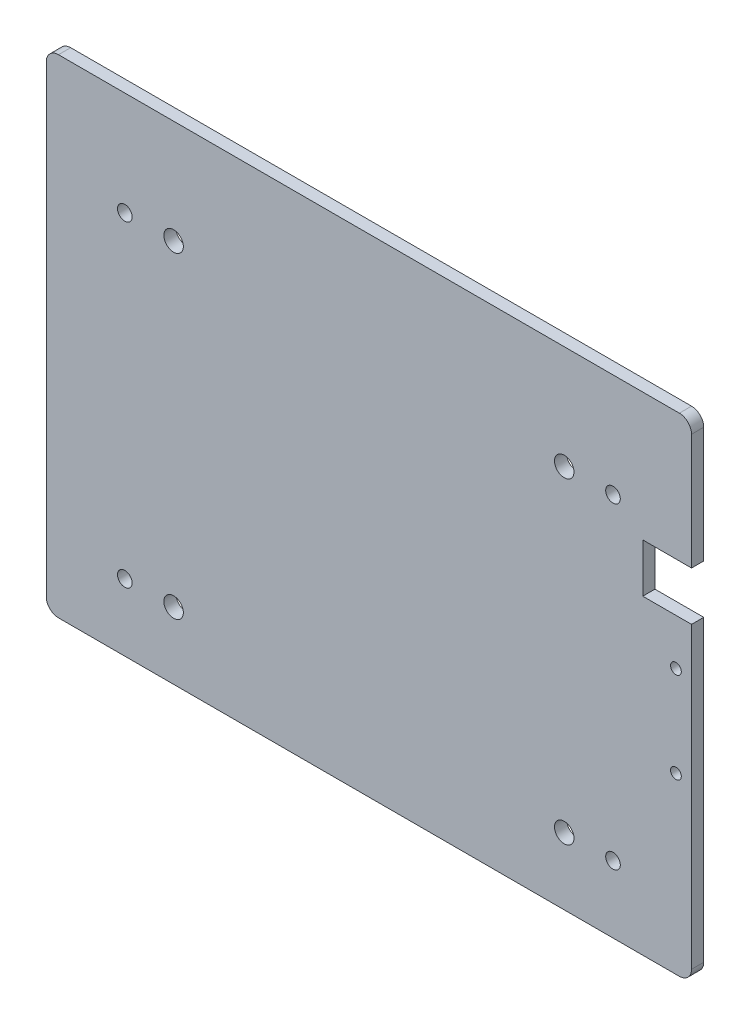
ISO-10303-21;
HEADER;
FILE_DESCRIPTION(('STEP AP214'),'2;1');
FILE_NAME('part.step','',(''),(''),'','','');
FILE_SCHEMA(('AUTOMOTIVE_DESIGN { 1 0 10303 214 1 1 1 1 }'));
ENDSEC;
DATA;
#1=APPLICATION_CONTEXT('core data for automotive mechanical design processes');
#2=APPLICATION_PROTOCOL_DEFINITION('international standard','automotive_design',2000,#1);
#3=PRODUCT_CONTEXT('',#1,'mechanical');
#4=PRODUCT('Part','Part','',(#3));
#5=PRODUCT_RELATED_PRODUCT_CATEGORY('part','',(#4));
#6=PRODUCT_DEFINITION_FORMATION('','',#4);
#7=PRODUCT_DEFINITION_CONTEXT('part definition',#1,'design');
#8=PRODUCT_DEFINITION('design','',#6,#7);
#9=PRODUCT_DEFINITION_SHAPE('','',#8);
#10=(LENGTH_UNIT() NAMED_UNIT(*) SI_UNIT(.MILLI.,.METRE.));
#11=(NAMED_UNIT(*) PLANE_ANGLE_UNIT() SI_UNIT($,.RADIAN.));
#12=(NAMED_UNIT(*) SI_UNIT($,.STERADIAN.) SOLID_ANGLE_UNIT());
#13=UNCERTAINTY_MEASURE_WITH_UNIT(LENGTH_MEASURE(1.E-05),#10,'distance_accuracy_value','');
#14=(GEOMETRIC_REPRESENTATION_CONTEXT(3) GLOBAL_UNCERTAINTY_ASSIGNED_CONTEXT((#13)) GLOBAL_UNIT_ASSIGNED_CONTEXT((#10,
#11,#12)) REPRESENTATION_CONTEXT('',''));
#15=CARTESIAN_POINT('',(0.,0.,0.));
#16=DIRECTION('',(0.,0.,1.));
#17=DIRECTION('',(1.,0.,0.));
#18=AXIS2_PLACEMENT_3D('',#15,#16,#17);
#19=CARTESIAN_POINT('',(-15.2,-30.,5.));
#20=DIRECTION('',(1.,0.,0.));
#21=DIRECTION('',(0.,1.,0.));
#22=AXIS2_PLACEMENT_3D('',#19,#20,#21);
#23=PLANE('',#22);
#24=DIRECTION('',(0.,0.,1.));
#25=VECTOR('',#24,1.);
#26=CARTESIAN_POINT('',(-15.2,-102.5,0.));
#27=LINE('',#26,#25);
#28=CARTESIAN_POINT('',(-15.2,-102.5,0.));
#29=VERTEX_POINT('',#28);
#30=CARTESIAN_POINT('',(-15.2,-102.5,5.));
#31=VERTEX_POINT('',#30);
#32=EDGE_CURVE('E155',#29,#31,#27,.T.);
#33=ORIENTED_EDGE('',*,*,#32,.T.);
#34=DIRECTION('',(0.,-1.,0.));
#35=VECTOR('',#34,1.);
#36=CARTESIAN_POINT('',(-15.2,-30.,5.));
#37=LINE('',#36,#35);
#38=CARTESIAN_POINT('',(-15.2,-225.,5.));
#39=VERTEX_POINT('',#38);
#40=EDGE_CURVE('E57',#31,#39,#37,.T.);
#41=ORIENTED_EDGE('',*,*,#40,.T.);
#42=DIRECTION('',(0.,0.,-1.));
#43=VECTOR('',#42,1.);
#44=CARTESIAN_POINT('',(-15.2,-225.,5.));
#45=LINE('',#44,#43);
#46=CARTESIAN_POINT('',(-15.2,-225.,0.));
#47=VERTEX_POINT('',#46);
#48=EDGE_CURVE('E268',#39,#47,#45,.T.);
#49=ORIENTED_EDGE('',*,*,#48,.T.);
#50=DIRECTION('',(0.,-1.,0.));
#51=VECTOR('',#50,1.);
#52=CARTESIAN_POINT('',(-15.2,-30.,0.));
#53=LINE('',#52,#51);
#54=EDGE_CURVE('E239',#29,#47,#53,.T.);
#55=ORIENTED_EDGE('',*,*,#54,.F.);
#56=EDGE_LOOP('',(#33,#41,#49,#55));
#57=FACE_BOUND('',#56,.T.);
#58=ADVANCED_FACE('F34',(#57),#23,.T.);
#59=CARTESIAN_POINT('',(0.,0.,0.));
#60=DIRECTION('',(0.,0.,-1.));
#61=DIRECTION('',(-1.,0.,0.));
#62=AXIS2_PLACEMENT_3D('',#59,#60,#61);
#63=PLANE('',#62);
#64=DIRECTION('',(1.,0.,0.));
#65=VECTOR('',#64,1.);
#66=CARTESIAN_POINT('',(-15.2,-102.5,0.));
#67=LINE('',#66,#65);
#68=CARTESIAN_POINT('',(-35.2,-102.5,0.));
#69=VERTEX_POINT('',#68);
#70=EDGE_CURVE('E140',#69,#29,#67,.T.);
#71=ORIENTED_EDGE('',*,*,#70,.T.);
#72=ORIENTED_EDGE('',*,*,#54,.T.);
#73=CARTESIAN_POINT('',(-20.2,-225.,0.));
#74=DIRECTION('',(0.,0.,-1.));
#75=DIRECTION('',(-1.,0.,0.));
#76=AXIS2_PLACEMENT_3D('',#73,#74,#75);
#77=CIRCLE('',#76,5.);
#78=CARTESIAN_POINT('',(-20.2,-230.,0.));
#79=VERTEX_POINT('',#78);
#80=EDGE_CURVE('E247',#47,#79,#77,.T.);
#81=ORIENTED_EDGE('',*,*,#80,.T.);
#82=DIRECTION('',(-1.,0.,0.));
#83=VECTOR('',#82,1.);
#84=CARTESIAN_POINT('',(-15.2,-230.,0.));
#85=LINE('',#84,#83);
#86=CARTESIAN_POINT('',(-274.8,-230.,0.));
#87=VERTEX_POINT('',#86);
#88=EDGE_CURVE('E224',#79,#87,#85,.T.);
#89=ORIENTED_EDGE('',*,*,#88,.T.);
#90=CARTESIAN_POINT('',(-274.8,-225.,0.));
#91=DIRECTION('',(0.,0.,-1.));
#92=DIRECTION('',(-1.,0.,0.));
#93=AXIS2_PLACEMENT_3D('',#90,#91,#92);
#94=CIRCLE('',#93,5.);
#95=CARTESIAN_POINT('',(-279.8,-225.,0.));
#96=VERTEX_POINT('',#95);
#97=EDGE_CURVE('E249',#87,#96,#94,.T.);
#98=ORIENTED_EDGE('',*,*,#97,.T.);
#99=DIRECTION('',(0.,1.,0.));
#100=VECTOR('',#99,1.);
#101=CARTESIAN_POINT('',(-279.8,-30.,0.));
#102=LINE('',#101,#100);
#103=CARTESIAN_POINT('',(-279.8,-35.,0.));
#104=VERTEX_POINT('',#103);
#105=EDGE_CURVE('E217',#96,#104,#102,.T.);
#106=ORIENTED_EDGE('',*,*,#105,.T.);
#107=CARTESIAN_POINT('',(-274.8,-35.,0.));
#108=DIRECTION('',(0.,0.,-1.));
#109=DIRECTION('',(-1.,0.,0.));
#110=AXIS2_PLACEMENT_3D('',#107,#108,#109);
#111=CIRCLE('',#110,5.);
#112=CARTESIAN_POINT('',(-274.8,-30.,0.));
#113=VERTEX_POINT('',#112);
#114=EDGE_CURVE('E253',#104,#113,#111,.T.);
#115=ORIENTED_EDGE('',*,*,#114,.T.);
#116=DIRECTION('',(1.,0.,0.));
#117=VECTOR('',#116,1.);
#118=CARTESIAN_POINT('',(-15.2,-30.,0.));
#119=LINE('',#118,#117);
#120=CARTESIAN_POINT('',(-20.2,-30.,0.));
#121=VERTEX_POINT('',#120);
#122=EDGE_CURVE('E236',#113,#121,#119,.T.);
#123=ORIENTED_EDGE('',*,*,#122,.T.);
#124=CARTESIAN_POINT('',(-20.2,-35.,0.));
#125=DIRECTION('',(0.,0.,-1.));
#126=DIRECTION('',(-1.,0.,0.));
#127=AXIS2_PLACEMENT_3D('',#124,#125,#126);
#128=CIRCLE('',#127,5.);
#129=CARTESIAN_POINT('',(-15.2,-35.,0.));
#130=VERTEX_POINT('',#129);
#131=EDGE_CURVE('E251',#121,#130,#128,.T.);
#132=ORIENTED_EDGE('',*,*,#131,.T.);
#133=CARTESIAN_POINT('',(-15.2,-82.5000000000003,0.));
#134=VERTEX_POINT('',#133);
#135=EDGE_CURVE('E146',#130,#134,#53,.T.);
#136=ORIENTED_EDGE('',*,*,#135,.T.);
#137=DIRECTION('',(-1.,0.,0.));
#138=VECTOR('',#137,1.);
#139=CARTESIAN_POINT('',(-15.2,-82.5000000000005,0.));
#140=LINE('',#139,#138);
#141=CARTESIAN_POINT('',(-35.2,-82.5000000000003,0.));
#142=VERTEX_POINT('',#141);
#143=EDGE_CURVE('E49',#134,#142,#140,.T.);
#144=ORIENTED_EDGE('',*,*,#143,.T.);
#145=DIRECTION('',(0.,-1.,0.));
#146=VECTOR('',#145,1.);
#147=CARTESIAN_POINT('',(-35.2,-102.5,0.));
#148=LINE('',#147,#146);
#149=EDGE_CURVE('E135',#142,#69,#148,.T.);
#150=ORIENTED_EDGE('',*,*,#149,.T.);
#151=EDGE_LOOP('',(#71,#72,#81,#89,#98,#106,#115,#123,#132,#136,#144,#150));
#152=FACE_BOUND('',#151,.T.);
#153=CARTESIAN_POINT('',(-21.6,-158.600000000001,0.));
#154=DIRECTION('',(0.,0.,1.));
#155=DIRECTION('',(1.,0.,0.));
#156=AXIS2_PLACEMENT_3D('',#153,#154,#155);
#157=CIRCLE('',#156,2.20000000000001);
#158=CARTESIAN_POINT('',(-19.4,-158.600000000001,0.));
#159=VERTEX_POINT('',#158);
#160=EDGE_CURVE('E160',#159,#159,#157,.T.);
#161=ORIENTED_EDGE('',*,*,#160,.T.);
#162=EDGE_LOOP('',(#161));
#163=FACE_BOUND('',#162,.T.);
#164=CARTESIAN_POINT('',(-21.6,-121.400000000001,0.));
#165=DIRECTION('',(0.,0.,1.));
#166=DIRECTION('',(1.,0.,0.));
#167=AXIS2_PLACEMENT_3D('',#164,#165,#166);
#168=CIRCLE('',#167,2.20000000000001);
#169=CARTESIAN_POINT('',(-19.4,-121.400000000001,0.));
#170=VERTEX_POINT('',#169);
#171=EDGE_CURVE('E167',#170,#170,#168,.T.);
#172=ORIENTED_EDGE('',*,*,#171,.T.);
#173=EDGE_LOOP('',(#172));
#174=FACE_BOUND('',#173,.T.);
#175=CARTESIAN_POINT('',(-227.590541186636,-202.530608434769,0.));
#176=DIRECTION('',(0.,0.,1.));
#177=DIRECTION('',(1.,0.,0.));
#178=AXIS2_PLACEMENT_3D('',#175,#176,#177);
#179=CIRCLE('',#178,3.99999999999999);
#180=CARTESIAN_POINT('',(-223.590541186636,-202.530608434769,0.));
#181=VERTEX_POINT('',#180);
#182=EDGE_CURVE('E172',#181,#181,#179,.F.);
#183=ORIENTED_EDGE('',*,*,#182,.F.);
#184=EDGE_LOOP('',(#183));
#185=FACE_BOUND('',#184,.T.);
#186=CARTESIAN_POINT('',(-67.4094588132849,-202.530608434769,0.));
#187=DIRECTION('',(0.,0.,1.));
#188=DIRECTION('',(1.,0.,0.));
#189=AXIS2_PLACEMENT_3D('',#186,#187,#188);
#190=CIRCLE('',#189,4.00000000000001);
#191=CARTESIAN_POINT('',(-63.4094588132849,-202.530608434769,0.));
#192=VERTEX_POINT('',#191);
#193=EDGE_CURVE('E190',#192,#192,#190,.T.);
#194=ORIENTED_EDGE('',*,*,#193,.T.);
#195=EDGE_LOOP('',(#194));
#196=FACE_BOUND('',#195,.T.);
#197=CARTESIAN_POINT('',(-247.590541186636,-72.5306084347687,0.));
#198=DIRECTION('',(0.,0.,-1.));
#199=DIRECTION('',(-1.,0.,0.));
#200=AXIS2_PLACEMENT_3D('',#197,#198,#199);
#201=CIRCLE('',#200,2.99999999999988);
#202=CARTESIAN_POINT('',(-250.590541186636,-72.5306084347687,0.));
#203=VERTEX_POINT('',#202);
#204=EDGE_CURVE('E193',#203,#203,#201,.T.);
#205=ORIENTED_EDGE('',*,*,#204,.F.);
#206=EDGE_LOOP('',(#205));
#207=FACE_BOUND('',#206,.T.);
#208=CARTESIAN_POINT('',(-247.590541186636,-202.530608434769,0.));
#209=DIRECTION('',(0.,0.,-1.));
#210=DIRECTION('',(-1.,0.,0.));
#211=AXIS2_PLACEMENT_3D('',#208,#209,#210);
#212=CIRCLE('',#211,2.99999999999993);
#213=CARTESIAN_POINT('',(-250.590541186636,-202.530608434769,0.));
#214=VERTEX_POINT('',#213);
#215=EDGE_CURVE('E206',#214,#214,#212,.T.);
#216=ORIENTED_EDGE('',*,*,#215,.F.);
#217=EDGE_LOOP('',(#216));
#218=FACE_BOUND('',#217,.T.);
#219=CARTESIAN_POINT('',(-47.4094588132849,-202.530608434769,0.));
#220=DIRECTION('',(0.,0.,-1.));
#221=DIRECTION('',(-1.,0.,0.));
#222=AXIS2_PLACEMENT_3D('',#219,#220,#221);
#223=CIRCLE('',#222,3.);
#224=CARTESIAN_POINT('',(-50.4094588132849,-202.530608434769,0.));
#225=VERTEX_POINT('',#224);
#226=EDGE_CURVE('E200',#225,#225,#223,.T.);
#227=ORIENTED_EDGE('',*,*,#226,.F.);
#228=EDGE_LOOP('',(#227));
#229=FACE_BOUND('',#228,.T.);
#230=CARTESIAN_POINT('',(-47.4094588132848,-72.5306084347687,0.));
#231=DIRECTION('',(0.,0.,-1.));
#232=DIRECTION('',(-1.,0.,0.));
#233=AXIS2_PLACEMENT_3D('',#230,#231,#232);
#234=CIRCLE('',#233,2.99999999999999);
#235=CARTESIAN_POINT('',(-50.4094588132848,-72.5306084347687,0.));
#236=VERTEX_POINT('',#235);
#237=EDGE_CURVE('E199',#236,#236,#234,.T.);
#238=ORIENTED_EDGE('',*,*,#237,.F.);
#239=EDGE_LOOP('',(#238));
#240=FACE_BOUND('',#239,.T.);
#241=CARTESIAN_POINT('',(-227.590541186636,-72.5306084347687,0.));
#242=DIRECTION('',(0.,0.,1.));
#243=DIRECTION('',(1.,0.,0.));
#244=AXIS2_PLACEMENT_3D('',#241,#242,#243);
#245=CIRCLE('',#244,3.99999999999996);
#246=CARTESIAN_POINT('',(-223.590541186636,-72.5306084347687,0.));
#247=VERTEX_POINT('',#246);
#248=EDGE_CURVE('E179',#247,#247,#245,.T.);
#249=ORIENTED_EDGE('',*,*,#248,.T.);
#250=EDGE_LOOP('',(#249));
#251=FACE_BOUND('',#250,.T.);
#252=CARTESIAN_POINT('',(-67.4094588132849,-72.5306084347687,0.));
#253=DIRECTION('',(0.,0.,1.));
#254=DIRECTION('',(1.,0.,0.));
#255=AXIS2_PLACEMENT_3D('',#252,#253,#254);
#256=CIRCLE('',#255,3.99999999999993);
#257=CARTESIAN_POINT('',(-63.4094588132849,-72.5306084347687,0.));
#258=VERTEX_POINT('',#257);
#259=EDGE_CURVE('E185',#258,#258,#256,.F.);
#260=ORIENTED_EDGE('',*,*,#259,.F.);
#261=EDGE_LOOP('',(#260));
#262=FACE_BOUND('',#261,.T.);
#263=ADVANCED_FACE('F143',(#152,#163,#174,#185,#196,#207,#218,#229,#240,#251,#262),#63,.T.);
#264=CARTESIAN_POINT('',(0.,0.,5.));
#265=DIRECTION('',(0.,0.,-1.));
#266=DIRECTION('',(-1.,0.,0.));
#267=AXIS2_PLACEMENT_3D('',#264,#265,#266);
#268=PLANE('',#267);
#269=CARTESIAN_POINT('',(-21.6,-158.600000000001,5.));
#270=DIRECTION('',(0.,0.,1.));
#271=DIRECTION('',(1.,0.,0.));
#272=AXIS2_PLACEMENT_3D('',#269,#270,#271);
#273=CIRCLE('',#272,2.20000000000001);
#274=CARTESIAN_POINT('',(-19.4,-158.600000000001,5.));
#275=VERTEX_POINT('',#274);
#276=EDGE_CURVE('E164',#275,#275,#273,.T.);
#277=ORIENTED_EDGE('',*,*,#276,.F.);
#278=EDGE_LOOP('',(#277));
#279=FACE_BOUND('',#278,.T.);
#280=CARTESIAN_POINT('',(-21.6,-121.400000000001,5.));
#281=DIRECTION('',(0.,0.,1.));
#282=DIRECTION('',(1.,0.,0.));
#283=AXIS2_PLACEMENT_3D('',#280,#281,#282);
#284=CIRCLE('',#283,2.20000000000001);
#285=CARTESIAN_POINT('',(-19.4,-121.400000000001,5.));
#286=VERTEX_POINT('',#285);
#287=EDGE_CURVE('E157',#286,#286,#284,.T.);
#288=ORIENTED_EDGE('',*,*,#287,.F.);
#289=EDGE_LOOP('',(#288));
#290=FACE_BOUND('',#289,.T.);
#291=CARTESIAN_POINT('',(-227.590541186636,-72.5306084347687,5.));
#292=DIRECTION('',(0.,0.,1.));
#293=DIRECTION('',(1.,0.,0.));
#294=AXIS2_PLACEMENT_3D('',#291,#292,#293);
#295=CIRCLE('',#294,3.99999999999996);
#296=CARTESIAN_POINT('',(-223.590541186636,-72.5306084347687,5.));
#297=VERTEX_POINT('',#296);
#298=EDGE_CURVE('E182',#297,#297,#295,.T.);
#299=ORIENTED_EDGE('',*,*,#298,.F.);
#300=EDGE_LOOP('',(#299));
#301=FACE_BOUND('',#300,.T.);
#302=CARTESIAN_POINT('',(-67.4094588132849,-202.530608434769,5.));
#303=DIRECTION('',(0.,0.,1.));
#304=DIRECTION('',(1.,0.,0.));
#305=AXIS2_PLACEMENT_3D('',#302,#303,#304);
#306=CIRCLE('',#305,4.00000000000001);
#307=CARTESIAN_POINT('',(-63.4094588132849,-202.530608434769,5.));
#308=VERTEX_POINT('',#307);
#309=EDGE_CURVE('E175',#308,#308,#306,.T.);
#310=ORIENTED_EDGE('',*,*,#309,.F.);
#311=EDGE_LOOP('',(#310));
#312=FACE_BOUND('',#311,.T.);
#313=CARTESIAN_POINT('',(-247.590541186636,-72.5306084347687,5.));
#314=DIRECTION('',(0.,0.,-1.));
#315=DIRECTION('',(-1.,0.,0.));
#316=AXIS2_PLACEMENT_3D('',#313,#314,#315);
#317=CIRCLE('',#316,2.99999999999988);
#318=CARTESIAN_POINT('',(-250.590541186636,-72.5306084347687,5.));
#319=VERTEX_POINT('',#318);
#320=EDGE_CURVE('E209',#319,#319,#317,.T.);
#321=ORIENTED_EDGE('',*,*,#320,.T.);
#322=EDGE_LOOP('',(#321));
#323=FACE_BOUND('',#322,.T.);
#324=CARTESIAN_POINT('',(-247.590541186636,-202.530608434769,5.));
#325=DIRECTION('',(0.,0.,-1.));
#326=DIRECTION('',(-1.,0.,0.));
#327=AXIS2_PLACEMENT_3D('',#324,#325,#326);
#328=CIRCLE('',#327,2.99999999999993);
#329=CARTESIAN_POINT('',(-250.590541186636,-202.530608434769,5.));
#330=VERTEX_POINT('',#329);
#331=EDGE_CURVE('E203',#330,#330,#328,.T.);
#332=ORIENTED_EDGE('',*,*,#331,.T.);
#333=EDGE_LOOP('',(#332));
#334=FACE_BOUND('',#333,.T.);
#335=CARTESIAN_POINT('',(-47.4094588132849,-202.530608434769,5.));
#336=DIRECTION('',(0.,0.,-1.));
#337=DIRECTION('',(-1.,0.,0.));
#338=AXIS2_PLACEMENT_3D('',#335,#336,#337);
#339=CIRCLE('',#338,3.);
#340=CARTESIAN_POINT('',(-50.4094588132849,-202.530608434769,5.));
#341=VERTEX_POINT('',#340);
#342=EDGE_CURVE('E196',#341,#341,#339,.T.);
#343=ORIENTED_EDGE('',*,*,#342,.T.);
#344=EDGE_LOOP('',(#343));
#345=FACE_BOUND('',#344,.T.);
#346=CARTESIAN_POINT('',(-47.4094588132848,-72.5306084347687,5.));
#347=DIRECTION('',(0.,0.,-1.));
#348=DIRECTION('',(-1.,0.,0.));
#349=AXIS2_PLACEMENT_3D('',#346,#347,#348);
#350=CIRCLE('',#349,2.99999999999999);
#351=CARTESIAN_POINT('',(-50.4094588132848,-72.5306084347687,5.));
#352=VERTEX_POINT('',#351);
#353=EDGE_CURVE('E214',#352,#352,#350,.T.);
#354=ORIENTED_EDGE('',*,*,#353,.T.);
#355=EDGE_LOOP('',(#354));
#356=FACE_BOUND('',#355,.T.);
#357=ORIENTED_EDGE('',*,*,#40,.F.);
#358=DIRECTION('',(1.,0.,0.));
#359=VECTOR('',#358,1.);
#360=CARTESIAN_POINT('',(-15.2,-102.5,5.));
#361=LINE('',#360,#359);
#362=CARTESIAN_POINT('',(-35.2,-102.5,5.));
#363=VERTEX_POINT('',#362);
#364=EDGE_CURVE('E147',#363,#31,#361,.T.);
#365=ORIENTED_EDGE('',*,*,#364,.F.);
#366=DIRECTION('',(0.,-1.,0.));
#367=VECTOR('',#366,1.);
#368=CARTESIAN_POINT('',(-35.2,-102.5,5.));
#369=LINE('',#368,#367);
#370=CARTESIAN_POINT('',(-35.2,-82.5000000000003,5.));
#371=VERTEX_POINT('',#370);
#372=EDGE_CURVE('E149',#371,#363,#369,.T.);
#373=ORIENTED_EDGE('',*,*,#372,.F.);
#374=DIRECTION('',(-1.,0.,0.));
#375=VECTOR('',#374,1.);
#376=CARTESIAN_POINT('',(-15.2,-82.5000000000005,5.));
#377=LINE('',#376,#375);
#378=CARTESIAN_POINT('',(-15.2,-82.5000000000005,5.));
#379=VERTEX_POINT('',#378);
#380=EDGE_CURVE('E127',#379,#371,#377,.T.);
#381=ORIENTED_EDGE('',*,*,#380,.F.);
#382=CARTESIAN_POINT('',(-15.2,-35.,5.));
#383=VERTEX_POINT('',#382);
#384=EDGE_CURVE('E227',#383,#379,#37,.T.);
#385=ORIENTED_EDGE('',*,*,#384,.F.);
#386=CARTESIAN_POINT('',(-20.2,-35.,5.));
#387=DIRECTION('',(0.,0.,-1.));
#388=DIRECTION('',(-1.,0.,0.));
#389=AXIS2_PLACEMENT_3D('',#386,#387,#388);
#390=CIRCLE('',#389,5.);
#391=CARTESIAN_POINT('',(-20.2,-30.,5.));
#392=VERTEX_POINT('',#391);
#393=EDGE_CURVE('E264',#383,#392,#390,.F.);
#394=ORIENTED_EDGE('',*,*,#393,.T.);
#395=DIRECTION('',(1.,0.,0.));
#396=VECTOR('',#395,1.);
#397=CARTESIAN_POINT('',(-15.2,-30.,5.));
#398=LINE('',#397,#396);
#399=CARTESIAN_POINT('',(-274.8,-30.,5.));
#400=VERTEX_POINT('',#399);
#401=EDGE_CURVE('E223',#400,#392,#398,.T.);
#402=ORIENTED_EDGE('',*,*,#401,.F.);
#403=CARTESIAN_POINT('',(-274.8,-35.,5.));
#404=DIRECTION('',(0.,0.,-1.));
#405=DIRECTION('',(-1.,0.,0.));
#406=AXIS2_PLACEMENT_3D('',#403,#404,#405);
#407=CIRCLE('',#406,5.);
#408=CARTESIAN_POINT('',(-279.8,-35.,5.));
#409=VERTEX_POINT('',#408);
#410=EDGE_CURVE('E266',#400,#409,#407,.F.);
#411=ORIENTED_EDGE('',*,*,#410,.T.);
#412=DIRECTION('',(0.,1.,0.));
#413=VECTOR('',#412,1.);
#414=CARTESIAN_POINT('',(-279.8,-30.,5.));
#415=LINE('',#414,#413);
#416=CARTESIAN_POINT('',(-279.8,-225.,5.));
#417=VERTEX_POINT('',#416);
#418=EDGE_CURVE('E220',#417,#409,#415,.T.);
#419=ORIENTED_EDGE('',*,*,#418,.F.);
#420=CARTESIAN_POINT('',(-274.8,-225.,5.));
#421=DIRECTION('',(0.,0.,-1.));
#422=DIRECTION('',(-1.,0.,0.));
#423=AXIS2_PLACEMENT_3D('',#420,#421,#422);
#424=CIRCLE('',#423,5.);
#425=CARTESIAN_POINT('',(-274.8,-230.,5.));
#426=VERTEX_POINT('',#425);
#427=EDGE_CURVE('E262',#417,#426,#424,.F.);
#428=ORIENTED_EDGE('',*,*,#427,.T.);
#429=DIRECTION('',(-1.,0.,0.));
#430=VECTOR('',#429,1.);
#431=CARTESIAN_POINT('',(-15.2,-230.,5.));
#432=LINE('',#431,#430);
#433=CARTESIAN_POINT('',(-20.2,-230.,5.));
#434=VERTEX_POINT('',#433);
#435=EDGE_CURVE('E230',#434,#426,#432,.T.);
#436=ORIENTED_EDGE('',*,*,#435,.F.);
#437=CARTESIAN_POINT('',(-20.2,-225.,5.));
#438=DIRECTION('',(0.,0.,-1.));
#439=DIRECTION('',(-1.,0.,0.));
#440=AXIS2_PLACEMENT_3D('',#437,#438,#439);
#441=CIRCLE('',#440,5.);
#442=EDGE_CURVE('E260',#434,#39,#441,.F.);
#443=ORIENTED_EDGE('',*,*,#442,.T.);
#444=EDGE_LOOP('',(#357,#365,#373,#381,#385,#394,#402,#411,#419,#428,#436,#443));
#445=FACE_BOUND('',#444,.T.);
#446=CARTESIAN_POINT('',(-227.590541186636,-202.530608434769,5.));
#447=DIRECTION('',(0.,0.,1.));
#448=DIRECTION('',(1.,0.,0.));
#449=AXIS2_PLACEMENT_3D('',#446,#447,#448);
#450=CIRCLE('',#449,3.99999999999999);
#451=CARTESIAN_POINT('',(-223.590541186636,-202.530608434769,5.));
#452=VERTEX_POINT('',#451);
#453=EDGE_CURVE('E176',#452,#452,#450,.F.);
#454=ORIENTED_EDGE('',*,*,#453,.T.);
#455=EDGE_LOOP('',(#454));
#456=FACE_BOUND('',#455,.T.);
#457=CARTESIAN_POINT('',(-67.4094588132849,-72.5306084347687,5.));
#458=DIRECTION('',(0.,0.,1.));
#459=DIRECTION('',(1.,0.,0.));
#460=AXIS2_PLACEMENT_3D('',#457,#458,#459);
#461=CIRCLE('',#460,3.99999999999993);
#462=CARTESIAN_POINT('',(-63.4094588132849,-72.5306084347687,5.));
#463=VERTEX_POINT('',#462);
#464=EDGE_CURVE('E163',#463,#463,#461,.F.);
#465=ORIENTED_EDGE('',*,*,#464,.T.);
#466=EDGE_LOOP('',(#465));
#467=FACE_BOUND('',#466,.T.);
#468=ADVANCED_FACE('F281',(#279,#290,#301,#312,#323,#334,#345,#356,#445,#456,#467),#268,.F.);
#469=CARTESIAN_POINT('',(-279.8,-30.,5.));
#470=DIRECTION('',(-1.,0.,0.));
#471=DIRECTION('',(0.,0.,1.));
#472=AXIS2_PLACEMENT_3D('',#469,#470,#471);
#473=PLANE('',#472);
#474=ORIENTED_EDGE('',*,*,#418,.T.);
#475=DIRECTION('',(0.,0.,-1.));
#476=VECTOR('',#475,1.);
#477=CARTESIAN_POINT('',(-279.8,-35.,5.));
#478=LINE('',#477,#476);
#479=EDGE_CURVE('E244',#409,#104,#478,.T.);
#480=ORIENTED_EDGE('',*,*,#479,.T.);
#481=ORIENTED_EDGE('',*,*,#105,.F.);
#482=DIRECTION('',(0.,0.,-1.));
#483=VECTOR('',#482,1.);
#484=CARTESIAN_POINT('',(-279.8,-225.,5.));
#485=LINE('',#484,#483);
#486=EDGE_CURVE('E233',#96,#417,#485,.F.);
#487=ORIENTED_EDGE('',*,*,#486,.T.);
#488=EDGE_LOOP('',(#474,#480,#481,#487));
#489=FACE_BOUND('',#488,.T.);
#490=ADVANCED_FACE('F308',(#489),#473,.T.);
#491=CARTESIAN_POINT('',(-15.2,-230.,5.));
#492=DIRECTION('',(0.,-1.,0.));
#493=DIRECTION('',(0.,0.,-1.));
#494=AXIS2_PLACEMENT_3D('',#491,#492,#493);
#495=PLANE('',#494);
#496=ORIENTED_EDGE('',*,*,#435,.T.);
#497=DIRECTION('',(0.,0.,-1.));
#498=VECTOR('',#497,1.);
#499=CARTESIAN_POINT('',(-274.8,-230.,5.));
#500=LINE('',#499,#498);
#501=EDGE_CURVE('E12',#426,#87,#500,.T.);
#502=ORIENTED_EDGE('',*,*,#501,.T.);
#503=ORIENTED_EDGE('',*,*,#88,.F.);
#504=DIRECTION('',(0.,0.,-1.));
#505=VECTOR('',#504,1.);
#506=CARTESIAN_POINT('',(-20.2,-230.,5.));
#507=LINE('',#506,#505);
#508=EDGE_CURVE('E42',#79,#434,#507,.F.);
#509=ORIENTED_EDGE('',*,*,#508,.T.);
#510=EDGE_LOOP('',(#496,#502,#503,#509));
#511=FACE_BOUND('',#510,.T.);
#512=ADVANCED_FACE('F275',(#511),#495,.T.);
#513=DIRECTION('',(0.,0.,1.));
#514=VECTOR('',#513,1.);
#515=CARTESIAN_POINT('',(-15.2,-82.5000000000005,0.));
#516=LINE('',#515,#514);
#517=EDGE_CURVE('E132',#134,#379,#516,.T.);
#518=ORIENTED_EDGE('',*,*,#517,.F.);
#519=ORIENTED_EDGE('',*,*,#135,.F.);
#520=DIRECTION('',(0.,0.,-1.));
#521=VECTOR('',#520,1.);
#522=CARTESIAN_POINT('',(-15.2,-35.,5.));
#523=LINE('',#522,#521);
#524=EDGE_CURVE('E270',#130,#383,#523,.F.);
#525=ORIENTED_EDGE('',*,*,#524,.T.);
#526=ORIENTED_EDGE('',*,*,#384,.T.);
#527=EDGE_LOOP('',(#518,#519,#525,#526));
#528=FACE_BOUND('',#527,.T.);
#529=ADVANCED_FACE('F293',(#528),#23,.T.);
#530=CARTESIAN_POINT('',(-15.2,-30.,5.));
#531=DIRECTION('',(0.,1.,0.));
#532=DIRECTION('',(0.,0.,1.));
#533=AXIS2_PLACEMENT_3D('',#530,#531,#532);
#534=PLANE('',#533);
#535=ORIENTED_EDGE('',*,*,#122,.F.);
#536=DIRECTION('',(0.,0.,-1.));
#537=VECTOR('',#536,1.);
#538=CARTESIAN_POINT('',(-274.8,-30.,5.));
#539=LINE('',#538,#537);
#540=EDGE_CURVE('E258',#113,#400,#539,.F.);
#541=ORIENTED_EDGE('',*,*,#540,.T.);
#542=ORIENTED_EDGE('',*,*,#401,.T.);
#543=DIRECTION('',(0.,0.,-1.));
#544=VECTOR('',#543,1.);
#545=CARTESIAN_POINT('',(-20.2,-30.,5.));
#546=LINE('',#545,#544);
#547=EDGE_CURVE('E255',#392,#121,#546,.T.);
#548=ORIENTED_EDGE('',*,*,#547,.T.);
#549=EDGE_LOOP('',(#535,#541,#542,#548));
#550=FACE_BOUND('',#549,.T.);
#551=ADVANCED_FACE('F302',(#550),#534,.T.);
#552=CARTESIAN_POINT('',(-274.8,-35.,5.));
#553=DIRECTION('',(0.,0.,-1.));
#554=DIRECTION('',(-1.,0.,0.));
#555=AXIS2_PLACEMENT_3D('',#552,#553,#554);
#556=CYLINDRICAL_SURFACE('',#555,5.);
#557=ORIENTED_EDGE('',*,*,#410,.F.);
#558=ORIENTED_EDGE('',*,*,#540,.F.);
#559=ORIENTED_EDGE('',*,*,#114,.F.);
#560=ORIENTED_EDGE('',*,*,#479,.F.);
#561=EDGE_LOOP('',(#557,#558,#559,#560));
#562=FACE_BOUND('',#561,.T.);
#563=ADVANCED_FACE('F305',(#562),#556,.T.);
#564=CARTESIAN_POINT('',(-20.2,-35.,5.));
#565=DIRECTION('',(0.,0.,-1.));
#566=DIRECTION('',(-1.,0.,0.));
#567=AXIS2_PLACEMENT_3D('',#564,#565,#566);
#568=CYLINDRICAL_SURFACE('',#567,5.);
#569=ORIENTED_EDGE('',*,*,#393,.F.);
#570=ORIENTED_EDGE('',*,*,#524,.F.);
#571=ORIENTED_EDGE('',*,*,#131,.F.);
#572=ORIENTED_EDGE('',*,*,#547,.F.);
#573=EDGE_LOOP('',(#569,#570,#571,#572));
#574=FACE_BOUND('',#573,.T.);
#575=ADVANCED_FACE('F296',(#574),#568,.T.);
#576=CARTESIAN_POINT('',(-274.8,-225.,5.));
#577=DIRECTION('',(0.,0.,-1.));
#578=DIRECTION('',(-1.,0.,0.));
#579=AXIS2_PLACEMENT_3D('',#576,#577,#578);
#580=CYLINDRICAL_SURFACE('',#579,5.);
#581=ORIENTED_EDGE('',*,*,#427,.F.);
#582=ORIENTED_EDGE('',*,*,#486,.F.);
#583=ORIENTED_EDGE('',*,*,#97,.F.);
#584=ORIENTED_EDGE('',*,*,#501,.F.);
#585=EDGE_LOOP('',(#581,#582,#583,#584));
#586=FACE_BOUND('',#585,.T.);
#587=ADVANCED_FACE('F312',(#586),#580,.T.);
#588=CARTESIAN_POINT('',(-20.2,-225.,5.));
#589=DIRECTION('',(0.,0.,-1.));
#590=DIRECTION('',(-1.,0.,0.));
#591=AXIS2_PLACEMENT_3D('',#588,#589,#590);
#592=CYLINDRICAL_SURFACE('',#591,5.);
#593=ORIENTED_EDGE('',*,*,#442,.F.);
#594=ORIENTED_EDGE('',*,*,#508,.F.);
#595=ORIENTED_EDGE('',*,*,#80,.F.);
#596=ORIENTED_EDGE('',*,*,#48,.F.);
#597=EDGE_LOOP('',(#593,#594,#595,#596));
#598=FACE_BOUND('',#597,.T.);
#599=ADVANCED_FACE('F36',(#598),#592,.T.);
#600=CARTESIAN_POINT('',(-47.4094588132848,-72.5306084347687,5.));
#601=DIRECTION('',(0.,0.,-1.));
#602=DIRECTION('',(-1.,0.,0.));
#603=AXIS2_PLACEMENT_3D('',#600,#601,#602);
#604=CYLINDRICAL_SURFACE('',#603,2.99999999999999);
#605=ORIENTED_EDGE('',*,*,#353,.F.);
#606=EDGE_LOOP('',(#605));
#607=FACE_BOUND('',#606,.T.);
#608=ORIENTED_EDGE('',*,*,#237,.T.);
#609=EDGE_LOOP('',(#608));
#610=FACE_BOUND('',#609,.T.);
#611=ADVANCED_FACE('F318',(#607,#610),#604,.F.);
#612=CARTESIAN_POINT('',(-47.4094588132849,-202.530608434769,5.));
#613=DIRECTION('',(0.,0.,-1.));
#614=DIRECTION('',(-1.,0.,0.));
#615=AXIS2_PLACEMENT_3D('',#612,#613,#614);
#616=CYLINDRICAL_SURFACE('',#615,3.);
#617=ORIENTED_EDGE('',*,*,#342,.F.);
#618=EDGE_LOOP('',(#617));
#619=FACE_BOUND('',#618,.T.);
#620=ORIENTED_EDGE('',*,*,#226,.T.);
#621=EDGE_LOOP('',(#620));
#622=FACE_BOUND('',#621,.T.);
#623=ADVANCED_FACE('F340',(#619,#622),#616,.F.);
#624=CARTESIAN_POINT('',(-247.590541186636,-202.530608434769,5.));
#625=DIRECTION('',(0.,0.,-1.));
#626=DIRECTION('',(-1.,0.,0.));
#627=AXIS2_PLACEMENT_3D('',#624,#625,#626);
#628=CYLINDRICAL_SURFACE('',#627,2.99999999999993);
#629=ORIENTED_EDGE('',*,*,#331,.F.);
#630=EDGE_LOOP('',(#629));
#631=FACE_BOUND('',#630,.T.);
#632=ORIENTED_EDGE('',*,*,#215,.T.);
#633=EDGE_LOOP('',(#632));
#634=FACE_BOUND('',#633,.T.);
#635=ADVANCED_FACE('F346',(#631,#634),#628,.F.);
#636=CARTESIAN_POINT('',(-247.590541186636,-72.5306084347687,5.));
#637=DIRECTION('',(0.,0.,-1.));
#638=DIRECTION('',(-1.,0.,0.));
#639=AXIS2_PLACEMENT_3D('',#636,#637,#638);
#640=CYLINDRICAL_SURFACE('',#639,2.99999999999988);
#641=ORIENTED_EDGE('',*,*,#320,.F.);
#642=EDGE_LOOP('',(#641));
#643=FACE_BOUND('',#642,.T.);
#644=ORIENTED_EDGE('',*,*,#204,.T.);
#645=EDGE_LOOP('',(#644));
#646=FACE_BOUND('',#645,.T.);
#647=ADVANCED_FACE('F342',(#643,#646),#640,.F.);
#648=CARTESIAN_POINT('',(-67.4094588132849,-202.530608434769,0.));
#649=DIRECTION('',(0.,0.,1.));
#650=DIRECTION('',(1.,0.,0.));
#651=AXIS2_PLACEMENT_3D('',#648,#649,#650);
#652=CYLINDRICAL_SURFACE('',#651,4.00000000000001);
#653=ORIENTED_EDGE('',*,*,#193,.F.);
#654=EDGE_LOOP('',(#653));
#655=FACE_BOUND('',#654,.T.);
#656=ORIENTED_EDGE('',*,*,#309,.T.);
#657=EDGE_LOOP('',(#656));
#658=FACE_BOUND('',#657,.T.);
#659=ADVANCED_FACE('F345',(#655,#658),#652,.F.);
#660=CARTESIAN_POINT('',(-227.590541186636,-202.530608434769,0.));
#661=DIRECTION('',(0.,0.,1.));
#662=DIRECTION('',(1.,0.,0.));
#663=AXIS2_PLACEMENT_3D('',#660,#661,#662);
#664=CYLINDRICAL_SURFACE('',#663,3.99999999999999);
#665=ORIENTED_EDGE('',*,*,#182,.T.);
#666=EDGE_LOOP('',(#665));
#667=FACE_BOUND('',#666,.T.);
#668=ORIENTED_EDGE('',*,*,#453,.F.);
#669=EDGE_LOOP('',(#668));
#670=FACE_BOUND('',#669,.T.);
#671=ADVANCED_FACE('F356',(#667,#670),#664,.F.);
#672=CARTESIAN_POINT('',(-227.590541186636,-72.5306084347687,0.));
#673=DIRECTION('',(0.,0.,1.));
#674=DIRECTION('',(1.,0.,0.));
#675=AXIS2_PLACEMENT_3D('',#672,#673,#674);
#676=CYLINDRICAL_SURFACE('',#675,3.99999999999996);
#677=ORIENTED_EDGE('',*,*,#248,.F.);
#678=EDGE_LOOP('',(#677));
#679=FACE_BOUND('',#678,.T.);
#680=ORIENTED_EDGE('',*,*,#298,.T.);
#681=EDGE_LOOP('',(#680));
#682=FACE_BOUND('',#681,.T.);
#683=ADVANCED_FACE('F362',(#679,#682),#676,.F.);
#684=CARTESIAN_POINT('',(-67.4094588132849,-72.5306084347687,0.));
#685=DIRECTION('',(0.,0.,1.));
#686=DIRECTION('',(1.,0.,0.));
#687=AXIS2_PLACEMENT_3D('',#684,#685,#686);
#688=CYLINDRICAL_SURFACE('',#687,3.99999999999993);
#689=ORIENTED_EDGE('',*,*,#259,.T.);
#690=EDGE_LOOP('',(#689));
#691=FACE_BOUND('',#690,.T.);
#692=ORIENTED_EDGE('',*,*,#464,.F.);
#693=EDGE_LOOP('',(#692));
#694=FACE_BOUND('',#693,.T.);
#695=ADVANCED_FACE('F358',(#691,#694),#688,.F.);
#696=CARTESIAN_POINT('',(-21.6,-121.400000000001,0.));
#697=DIRECTION('',(0.,0.,1.));
#698=DIRECTION('',(1.,0.,0.));
#699=AXIS2_PLACEMENT_3D('',#696,#697,#698);
#700=CYLINDRICAL_SURFACE('',#699,2.20000000000001);
#701=ORIENTED_EDGE('',*,*,#171,.F.);
#702=EDGE_LOOP('',(#701));
#703=FACE_BOUND('',#702,.T.);
#704=ORIENTED_EDGE('',*,*,#287,.T.);
#705=EDGE_LOOP('',(#704));
#706=FACE_BOUND('',#705,.T.);
#707=ADVANCED_FACE('F361',(#703,#706),#700,.F.);
#708=CARTESIAN_POINT('',(-21.6,-158.600000000001,0.));
#709=DIRECTION('',(0.,0.,1.));
#710=DIRECTION('',(1.,0.,0.));
#711=AXIS2_PLACEMENT_3D('',#708,#709,#710);
#712=CYLINDRICAL_SURFACE('',#711,2.20000000000001);
#713=ORIENTED_EDGE('',*,*,#160,.F.);
#714=EDGE_LOOP('',(#713));
#715=FACE_BOUND('',#714,.T.);
#716=ORIENTED_EDGE('',*,*,#276,.T.);
#717=EDGE_LOOP('',(#716));
#718=FACE_BOUND('',#717,.T.);
#719=ADVANCED_FACE('F372',(#715,#718),#712,.F.);
#720=CARTESIAN_POINT('',(-15.2,-102.5,0.));
#721=DIRECTION('',(0.,-1.,0.));
#722=DIRECTION('',(1.,0.,0.));
#723=AXIS2_PLACEMENT_3D('',#720,#721,#722);
#724=PLANE('',#723);
#725=ORIENTED_EDGE('',*,*,#364,.T.);
#726=ORIENTED_EDGE('',*,*,#32,.F.);
#727=ORIENTED_EDGE('',*,*,#70,.F.);
#728=DIRECTION('',(0.,0.,1.));
#729=VECTOR('',#728,1.);
#730=CARTESIAN_POINT('',(-35.2,-102.5,0.));
#731=LINE('',#730,#729);
#732=EDGE_CURVE('E131',#69,#363,#731,.T.);
#733=ORIENTED_EDGE('',*,*,#732,.T.);
#734=EDGE_LOOP('',(#725,#726,#727,#733));
#735=FACE_BOUND('',#734,.T.);
#736=ADVANCED_FACE('F288',(#735),#724,.F.);
#737=CARTESIAN_POINT('',(-35.2,-102.5,0.));
#738=DIRECTION('',(-1.,0.,0.));
#739=DIRECTION('',(0.,0.,1.));
#740=AXIS2_PLACEMENT_3D('',#737,#738,#739);
#741=PLANE('',#740);
#742=ORIENTED_EDGE('',*,*,#372,.T.);
#743=ORIENTED_EDGE('',*,*,#732,.F.);
#744=ORIENTED_EDGE('',*,*,#149,.F.);
#745=DIRECTION('',(0.,0.,1.));
#746=VECTOR('',#745,1.);
#747=CARTESIAN_POINT('',(-35.2,-82.5000000000003,0.));
#748=LINE('',#747,#746);
#749=EDGE_CURVE('E123',#142,#371,#748,.T.);
#750=ORIENTED_EDGE('',*,*,#749,.T.);
#751=EDGE_LOOP('',(#742,#743,#744,#750));
#752=FACE_BOUND('',#751,.T.);
#753=ADVANCED_FACE('F136',(#752),#741,.F.);
#754=CARTESIAN_POINT('',(-15.2,-82.5000000000005,0.));
#755=DIRECTION('',(0.,1.,0.));
#756=DIRECTION('',(-1.,0.,0.));
#757=AXIS2_PLACEMENT_3D('',#754,#755,#756);
#758=PLANE('',#757);
#759=ORIENTED_EDGE('',*,*,#380,.T.);
#760=ORIENTED_EDGE('',*,*,#749,.F.);
#761=ORIENTED_EDGE('',*,*,#143,.F.);
#762=ORIENTED_EDGE('',*,*,#517,.T.);
#763=EDGE_LOOP('',(#759,#760,#761,#762));
#764=FACE_BOUND('',#763,.T.);
#765=ADVANCED_FACE('F125',(#764),#758,.F.);
#766=CLOSED_SHELL('',(#58,#263,#468,#490,#512,#529,#551,#563,#575,#587,#599,#611,#623,#635,#647,
#659,#671,#683,#695,#707,#719,#736,#753,#765));
#767=MANIFOLD_SOLID_BREP('B2',#766);
#768=ADVANCED_BREP_SHAPE_REPRESENTATION('',(#18,#767),#14);
#769=SHAPE_DEFINITION_REPRESENTATION(#9,#768);
ENDSEC;
END-ISO-10303-21;
